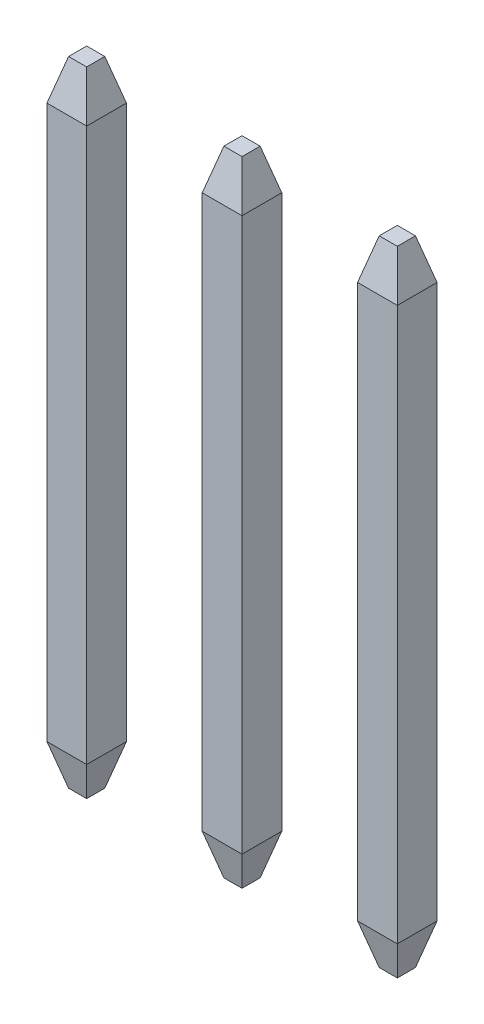
ISO-10303-21;
HEADER;
FILE_DESCRIPTION(('STEP AP214'),'2;1');
FILE_NAME('part.step','',(''),(''),'','','');
FILE_SCHEMA(('AUTOMOTIVE_DESIGN { 1 0 10303 214 1 1 1 1 }'));
ENDSEC;
DATA;
#1=APPLICATION_CONTEXT('core data for automotive mechanical design processes');
#2=APPLICATION_PROTOCOL_DEFINITION('international standard','automotive_design',2000,#1);
#3=PRODUCT_CONTEXT('',#1,'mechanical');
#4=PRODUCT('Part','Part','',(#3));
#5=PRODUCT_RELATED_PRODUCT_CATEGORY('part','',(#4));
#6=PRODUCT_DEFINITION_FORMATION('','',#4);
#7=PRODUCT_DEFINITION_CONTEXT('part definition',#1,'design');
#8=PRODUCT_DEFINITION('design','',#6,#7);
#9=PRODUCT_DEFINITION_SHAPE('','',#8);
#10=(LENGTH_UNIT() NAMED_UNIT(*) SI_UNIT(.MILLI.,.METRE.));
#11=(NAMED_UNIT(*) PLANE_ANGLE_UNIT() SI_UNIT($,.RADIAN.));
#12=(NAMED_UNIT(*) SI_UNIT($,.STERADIAN.) SOLID_ANGLE_UNIT());
#13=UNCERTAINTY_MEASURE_WITH_UNIT(LENGTH_MEASURE(1.E-05),#10,'distance_accuracy_value','');
#14=(GEOMETRIC_REPRESENTATION_CONTEXT(3) GLOBAL_UNCERTAINTY_ASSIGNED_CONTEXT((#13)) GLOBAL_UNIT_ASSIGNED_CONTEXT((#10,
#11,#12)) REPRESENTATION_CONTEXT('',''));
#15=CARTESIAN_POINT('',(0.,0.,0.));
#16=DIRECTION('',(0.,0.,1.));
#17=DIRECTION('',(1.,0.,0.));
#18=AXIS2_PLACEMENT_3D('',#15,#16,#17);
#19=CARTESIAN_POINT('',(-0.32,6.15,0.82));
#20=DIRECTION('',(0.,-0.258819045102985,-0.965925826288944));
#21=DIRECTION('',(0.,-0.965925826288944,0.258819045102985));
#22=AXIS2_PLACEMENT_3D('',#19,#20,#21);
#23=PLANE('',#22);
#24=DIRECTION('',(-0.250562807085973,0.9351131265309,-0.250562807085973));
#25=VECTOR('',#24,1.);
#26=CARTESIAN_POINT('',(0.13667737674,6.834169344185,0.63667737674));
#27=LINE('',#26,#25);
#28=CARTESIAN_POINT('',(0.32,6.15,0.82));
#29=VERTEX_POINT('',#28);
#30=CARTESIAN_POINT('',(0.14583302492,6.8,0.64583302492));
#31=VERTEX_POINT('',#30);
#32=EDGE_CURVE('P0_E26',#29,#31,#27,.T.);
#33=ORIENTED_EDGE('',*,*,#32,.T.);
#34=DIRECTION('',(1.,0.,0.));
#35=VECTOR('',#34,1.);
#36=CARTESIAN_POINT('',(0.,6.8,0.64583302492));
#37=LINE('',#36,#35);
#38=CARTESIAN_POINT('',(-0.14583302492,6.8,0.64583302492));
#39=VERTEX_POINT('',#38);
#40=EDGE_CURVE('P0_E185',#39,#31,#37,.T.);
#41=ORIENTED_EDGE('',*,*,#40,.F.);
#42=DIRECTION('',(-0.250562807085973,-0.9351131265309,0.250562807085973));
#43=VECTOR('',#42,1.);
#44=CARTESIAN_POINT('',(-0.13667737674,6.834169344185,0.63667737674));
#45=LINE('',#44,#43);
#46=CARTESIAN_POINT('',(-0.32,6.15,0.82));
#47=VERTEX_POINT('',#46);
#48=EDGE_CURVE('P0_E11',#39,#47,#45,.T.);
#49=ORIENTED_EDGE('',*,*,#48,.T.);
#50=DIRECTION('',(-1.,0.,0.));
#51=VECTOR('',#50,1.);
#52=CARTESIAN_POINT('',(-0.32,6.15,0.82));
#53=LINE('',#52,#51);
#54=EDGE_CURVE('P0_E129',#29,#47,#53,.T.);
#55=ORIENTED_EDGE('',*,*,#54,.F.);
#56=EDGE_LOOP('',(#33,#41,#49,#55));
#57=FACE_BOUND('',#56,.T.);
#58=ADVANCED_FACE('P0_F17',(#57),#23,.F.);
#59=CARTESIAN_POINT('',(-0.14583302492,6.8,0.5));
#60=DIRECTION('',(0.965925826288944,-0.258819045102985,0.));
#61=DIRECTION('',(0.,0.,-1.));
#62=AXIS2_PLACEMENT_3D('',#59,#60,#61);
#63=PLANE('',#62);
#64=DIRECTION('',(-0.250562807085973,-0.9351131265309,-0.250562807085973));
#65=VECTOR('',#64,1.);
#66=CARTESIAN_POINT('',(-0.13667737674,6.834169344185,0.36332262326));
#67=LINE('',#66,#65);
#68=CARTESIAN_POINT('',(-0.14583302492,6.8,0.35416697508));
#69=VERTEX_POINT('',#68);
#70=CARTESIAN_POINT('',(-0.32,6.15,0.18));
#71=VERTEX_POINT('',#70);
#72=EDGE_CURVE('P0_E197',#69,#71,#67,.T.);
#73=ORIENTED_EDGE('',*,*,#72,.T.);
#74=DIRECTION('',(0.,0.,-1.));
#75=VECTOR('',#74,1.);
#76=CARTESIAN_POINT('',(-0.32,6.15,0.82));
#77=LINE('',#76,#75);
#78=EDGE_CURVE('P0_E171',#47,#71,#77,.T.);
#79=ORIENTED_EDGE('',*,*,#78,.F.);
#80=ORIENTED_EDGE('',*,*,#48,.F.);
#81=DIRECTION('',(0.,0.,1.));
#82=VECTOR('',#81,1.);
#83=CARTESIAN_POINT('',(-0.14583302492,6.8,0.5));
#84=LINE('',#83,#82);
#85=EDGE_CURVE('P0_E181',#69,#39,#84,.T.);
#86=ORIENTED_EDGE('',*,*,#85,.F.);
#87=EDGE_LOOP('',(#73,#79,#80,#86));
#88=FACE_BOUND('',#87,.T.);
#89=ADVANCED_FACE('P0_F19',(#88),#63,.F.);
#90=CARTESIAN_POINT('',(0.14583302492,6.8,0.5));
#91=DIRECTION('',(-0.965925826288944,-0.258819045102985,0.));
#92=DIRECTION('',(-0.258819045102985,0.965925826288944,0.));
#93=AXIS2_PLACEMENT_3D('',#90,#91,#92);
#94=PLANE('',#93);
#95=DIRECTION('',(-0.250562807085973,0.9351131265309,0.250562807085973));
#96=VECTOR('',#95,1.);
#97=CARTESIAN_POINT('',(0.13667737674,6.834169344185,0.36332262326));
#98=LINE('',#97,#96);
#99=CARTESIAN_POINT('',(0.32,6.15,0.18));
#100=VERTEX_POINT('',#99);
#101=CARTESIAN_POINT('',(0.14583302492,6.8,0.35416697508));
#102=VERTEX_POINT('',#101);
#103=EDGE_CURVE('P0_E38',#100,#102,#98,.T.);
#104=ORIENTED_EDGE('',*,*,#103,.T.);
#105=DIRECTION('',(0.,0.,-1.));
#106=VECTOR('',#105,1.);
#107=CARTESIAN_POINT('',(0.14583302492,6.8,0.5));
#108=LINE('',#107,#106);
#109=EDGE_CURVE('P0_E189',#31,#102,#108,.T.);
#110=ORIENTED_EDGE('',*,*,#109,.F.);
#111=ORIENTED_EDGE('',*,*,#32,.F.);
#112=DIRECTION('',(0.,0.,1.));
#113=VECTOR('',#112,1.);
#114=CARTESIAN_POINT('',(0.32,6.15,0.82));
#115=LINE('',#114,#113);
#116=EDGE_CURVE('P0_E130',#100,#29,#115,.T.);
#117=ORIENTED_EDGE('',*,*,#116,.F.);
#118=EDGE_LOOP('',(#104,#110,#111,#117));
#119=FACE_BOUND('',#118,.T.);
#120=ADVANCED_FACE('P0_F327',(#119),#94,.F.);
#121=CARTESIAN_POINT('',(0.,6.8,0.35416697508));
#122=DIRECTION('',(0.,-0.258819045102985,0.965925826288944));
#123=DIRECTION('',(-1.,0.,0.));
#124=AXIS2_PLACEMENT_3D('',#121,#122,#123);
#125=PLANE('',#124);
#126=ORIENTED_EDGE('',*,*,#72,.F.);
#127=DIRECTION('',(-1.,0.,0.));
#128=VECTOR('',#127,1.);
#129=CARTESIAN_POINT('',(0.,6.8,0.35416697508));
#130=LINE('',#129,#128);
#131=EDGE_CURVE('P0_E117',#102,#69,#130,.T.);
#132=ORIENTED_EDGE('',*,*,#131,.F.);
#133=ORIENTED_EDGE('',*,*,#103,.F.);
#134=DIRECTION('',(1.,0.,0.));
#135=VECTOR('',#134,1.);
#136=CARTESIAN_POINT('',(-0.32,6.15,0.18));
#137=LINE('',#136,#135);
#138=EDGE_CURVE('P0_E144',#71,#100,#137,.T.);
#139=ORIENTED_EDGE('',*,*,#138,.F.);
#140=EDGE_LOOP('',(#126,#132,#133,#139));
#141=FACE_BOUND('',#140,.T.);
#142=ADVANCED_FACE('P0_F320',(#141),#125,.F.);
#143=CARTESIAN_POINT('',(-0.32,-3.4,0.35416697508));
#144=DIRECTION('',(0.,-0.258819045102985,-0.965925826288944));
#145=DIRECTION('',(0.,-0.965925826288944,0.258819045102985));
#146=AXIS2_PLACEMENT_3D('',#143,#144,#145);
#147=PLANE('',#146);
#148=DIRECTION('',(-0.250562807085973,0.9351131265309,-0.250562807085973));
#149=VECTOR('',#148,1.);
#150=CARTESIAN_POINT('',(-0.116587226245,-3.509146806561,0.383412773755));
#151=LINE('',#150,#149);
#152=CARTESIAN_POINT('',(-0.14583302492,-3.4,0.35416697508));
#153=VERTEX_POINT('',#152);
#154=CARTESIAN_POINT('',(-0.32,-2.75,0.18));
#155=VERTEX_POINT('',#154);
#156=EDGE_CURVE('P0_E157',#153,#155,#151,.T.);
#157=ORIENTED_EDGE('',*,*,#156,.T.);
#158=DIRECTION('',(-1.,0.,0.));
#159=VECTOR('',#158,1.);
#160=CARTESIAN_POINT('',(-0.32,-2.75,0.18));
#161=LINE('',#160,#159);
#162=CARTESIAN_POINT('',(0.32,-2.75,0.18));
#163=VERTEX_POINT('',#162);
#164=EDGE_CURVE('P0_E151',#163,#155,#161,.T.);
#165=ORIENTED_EDGE('',*,*,#164,.F.);
#166=DIRECTION('',(-0.250562807085973,-0.9351131265309,0.250562807085973));
#167=VECTOR('',#166,1.);
#168=CARTESIAN_POINT('',(0.116587226245,-3.509146806561,0.383412773755));
#169=LINE('',#168,#167);
#170=CARTESIAN_POINT('',(0.14583302492,-3.4,0.35416697508));
#171=VERTEX_POINT('',#170);
#172=EDGE_CURVE('P0_E135',#163,#171,#169,.T.);
#173=ORIENTED_EDGE('',*,*,#172,.T.);
#174=DIRECTION('',(1.,0.,0.));
#175=VECTOR('',#174,1.);
#176=CARTESIAN_POINT('',(0.32,-3.4,0.35416697508));
#177=LINE('',#176,#175);
#178=EDGE_CURVE('P0_E283',#153,#171,#177,.T.);
#179=ORIENTED_EDGE('',*,*,#178,.F.);
#180=EDGE_LOOP('',(#157,#165,#173,#179));
#181=FACE_BOUND('',#180,.T.);
#182=ADVANCED_FACE('P0_F318',(#181),#147,.T.);
#183=CARTESIAN_POINT('',(0.14583302492,-3.4,0.82));
#184=DIRECTION('',(0.965925826288944,-0.258819045102985,0.));
#185=DIRECTION('',(0.,0.,-1.));
#186=AXIS2_PLACEMENT_3D('',#183,#184,#185);
#187=PLANE('',#186);
#188=DIRECTION('',(-0.250562807085973,-0.9351131265309,-0.250562807085973));
#189=VECTOR('',#188,1.);
#190=CARTESIAN_POINT('',(0.156767527234,-3.359191881808,0.656767527234));
#191=LINE('',#190,#189);
#192=CARTESIAN_POINT('',(0.32,-2.75,0.82));
#193=VERTEX_POINT('',#192);
#194=CARTESIAN_POINT('',(0.14583302492,-3.4,0.64583302492));
#195=VERTEX_POINT('',#194);
#196=EDGE_CURVE('P0_E104',#193,#195,#191,.T.);
#197=ORIENTED_EDGE('',*,*,#196,.T.);
#198=DIRECTION('',(0.,0.,1.));
#199=VECTOR('',#198,1.);
#200=CARTESIAN_POINT('',(0.14583302492,-3.4,0.82));
#201=LINE('',#200,#199);
#202=EDGE_CURVE('P0_E161',#171,#195,#201,.T.);
#203=ORIENTED_EDGE('',*,*,#202,.F.);
#204=ORIENTED_EDGE('',*,*,#172,.F.);
#205=DIRECTION('',(0.,0.,-1.));
#206=VECTOR('',#205,1.);
#207=CARTESIAN_POINT('',(0.32,-2.75,0.18));
#208=LINE('',#207,#206);
#209=EDGE_CURVE('P0_E133',#193,#163,#208,.T.);
#210=ORIENTED_EDGE('',*,*,#209,.F.);
#211=EDGE_LOOP('',(#197,#203,#204,#210));
#212=FACE_BOUND('',#211,.T.);
#213=ADVANCED_FACE('P0_F134',(#212),#187,.T.);
#214=CARTESIAN_POINT('',(-0.14583302492,-3.4,0.82));
#215=DIRECTION('',(-0.965925826288944,-0.258819045102985,0.));
#216=DIRECTION('',(-0.258819045102985,0.965925826288944,0.));
#217=AXIS2_PLACEMENT_3D('',#214,#215,#216);
#218=PLANE('',#217);
#219=DIRECTION('',(-0.250562807085973,0.9351131265309,0.250562807085973));
#220=VECTOR('',#219,1.);
#221=CARTESIAN_POINT('',(-0.156767527234,-3.359191881808,0.656767527234));
#222=LINE('',#221,#220);
#223=CARTESIAN_POINT('',(-0.14583302492,-3.4,0.64583302492));
#224=VERTEX_POINT('',#223);
#225=CARTESIAN_POINT('',(-0.32,-2.75,0.82));
#226=VERTEX_POINT('',#225);
#227=EDGE_CURVE('P0_E116',#224,#226,#222,.T.);
#228=ORIENTED_EDGE('',*,*,#227,.T.);
#229=DIRECTION('',(0.,0.,1.));
#230=VECTOR('',#229,1.);
#231=CARTESIAN_POINT('',(-0.32,-2.75,0.82));
#232=LINE('',#231,#230);
#233=EDGE_CURVE('P0_E165',#155,#226,#232,.T.);
#234=ORIENTED_EDGE('',*,*,#233,.F.);
#235=ORIENTED_EDGE('',*,*,#156,.F.);
#236=DIRECTION('',(0.,0.,-1.));
#237=VECTOR('',#236,1.);
#238=CARTESIAN_POINT('',(-0.14583302492,-3.4,0.18));
#239=LINE('',#238,#237);
#240=EDGE_CURVE('P0_E288',#224,#153,#239,.T.);
#241=ORIENTED_EDGE('',*,*,#240,.F.);
#242=EDGE_LOOP('',(#228,#234,#235,#241));
#243=FACE_BOUND('',#242,.T.);
#244=ADVANCED_FACE('P0_F313',(#243),#218,.T.);
#245=CARTESIAN_POINT('',(-0.32,-3.4,0.64583302492));
#246=DIRECTION('',(0.,-0.258819045102985,0.965925826288944));
#247=DIRECTION('',(-1.,0.,0.));
#248=AXIS2_PLACEMENT_3D('',#245,#246,#247);
#249=PLANE('',#248);
#250=ORIENTED_EDGE('',*,*,#196,.F.);
#251=DIRECTION('',(1.,0.,0.));
#252=VECTOR('',#251,1.);
#253=CARTESIAN_POINT('',(0.32,-2.75,0.82));
#254=LINE('',#253,#252);
#255=EDGE_CURVE('P0_E107',#226,#193,#254,.T.);
#256=ORIENTED_EDGE('',*,*,#255,.F.);
#257=ORIENTED_EDGE('',*,*,#227,.F.);
#258=DIRECTION('',(-1.,0.,0.));
#259=VECTOR('',#258,1.);
#260=CARTESIAN_POINT('',(-0.32,-3.4,0.64583302492));
#261=LINE('',#260,#259);
#262=EDGE_CURVE('P0_E110',#195,#224,#261,.T.);
#263=ORIENTED_EDGE('',*,*,#262,.F.);
#264=EDGE_LOOP('',(#250,#256,#257,#263));
#265=FACE_BOUND('',#264,.T.);
#266=ADVANCED_FACE('P0_F106',(#265),#249,.T.);
#267=CARTESIAN_POINT('',(0.,6.8,0.5));
#268=DIRECTION('',(0.,-1.,0.));
#269=DIRECTION('',(0.,0.,-1.));
#270=AXIS2_PLACEMENT_3D('',#267,#268,#269);
#271=PLANE('',#270);
#272=ORIENTED_EDGE('',*,*,#85,.T.);
#273=ORIENTED_EDGE('',*,*,#40,.T.);
#274=ORIENTED_EDGE('',*,*,#109,.T.);
#275=ORIENTED_EDGE('',*,*,#131,.T.);
#276=EDGE_LOOP('',(#272,#273,#274,#275));
#277=FACE_BOUND('',#276,.T.);
#278=ADVANCED_FACE('P0_F343',(#277),#271,.F.);
#279=CARTESIAN_POINT('',(-0.32,7.705096679919,0.82));
#280=DIRECTION('',(0.,0.,-1.));
#281=DIRECTION('',(-1.,0.,0.));
#282=AXIS2_PLACEMENT_3D('',#279,#280,#281);
#283=PLANE('',#282);
#284=DIRECTION('',(0.,-1.,0.));
#285=VECTOR('',#284,1.);
#286=CARTESIAN_POINT('',(-0.32,7.705096679919,0.82));
#287=LINE('',#286,#285);
#288=EDGE_CURVE('P0_E126',#47,#226,#287,.T.);
#289=ORIENTED_EDGE('',*,*,#288,.T.);
#290=ORIENTED_EDGE('',*,*,#255,.T.);
#291=DIRECTION('',(0.,1.,0.));
#292=VECTOR('',#291,1.);
#293=CARTESIAN_POINT('',(0.32,7.705096679919,0.82));
#294=LINE('',#293,#292);
#295=EDGE_CURVE('P0_E124',#193,#29,#294,.T.);
#296=ORIENTED_EDGE('',*,*,#295,.T.);
#297=ORIENTED_EDGE('',*,*,#54,.T.);
#298=EDGE_LOOP('',(#289,#290,#296,#297));
#299=FACE_BOUND('',#298,.T.);
#300=ADVANCED_FACE('P0_F121',(#299),#283,.F.);
#301=CARTESIAN_POINT('',(0.32,7.705096679919,0.82));
#302=DIRECTION('',(-1.,0.,0.));
#303=DIRECTION('',(0.,0.,1.));
#304=AXIS2_PLACEMENT_3D('',#301,#302,#303);
#305=PLANE('',#304);
#306=ORIENTED_EDGE('',*,*,#295,.F.);
#307=ORIENTED_EDGE('',*,*,#209,.T.);
#308=DIRECTION('',(0.,1.,0.));
#309=VECTOR('',#308,1.);
#310=CARTESIAN_POINT('',(0.32,7.705096679919,0.18));
#311=LINE('',#310,#309);
#312=EDGE_CURVE('P0_E168',#163,#100,#311,.T.);
#313=ORIENTED_EDGE('',*,*,#312,.T.);
#314=ORIENTED_EDGE('',*,*,#116,.T.);
#315=EDGE_LOOP('',(#306,#307,#313,#314));
#316=FACE_BOUND('',#315,.T.);
#317=ADVANCED_FACE('P0_F142',(#316),#305,.F.);
#318=CARTESIAN_POINT('',(-0.32,7.705096679919,0.18));
#319=DIRECTION('',(0.,0.,1.));
#320=DIRECTION('',(1.,0.,0.));
#321=AXIS2_PLACEMENT_3D('',#318,#319,#320);
#322=PLANE('',#321);
#323=ORIENTED_EDGE('',*,*,#312,.F.);
#324=ORIENTED_EDGE('',*,*,#164,.T.);
#325=DIRECTION('',(0.,-1.,0.));
#326=VECTOR('',#325,1.);
#327=CARTESIAN_POINT('',(-0.32,7.705096679919,0.18));
#328=LINE('',#327,#326);
#329=EDGE_CURVE('P0_E160',#71,#155,#328,.T.);
#330=ORIENTED_EDGE('',*,*,#329,.F.);
#331=ORIENTED_EDGE('',*,*,#138,.T.);
#332=EDGE_LOOP('',(#323,#324,#330,#331));
#333=FACE_BOUND('',#332,.T.);
#334=ADVANCED_FACE('P0_F308',(#333),#322,.F.);
#335=CARTESIAN_POINT('',(-0.32,7.705096679919,0.82));
#336=DIRECTION('',(1.,0.,0.));
#337=DIRECTION('',(0.,1.,0.));
#338=AXIS2_PLACEMENT_3D('',#335,#336,#337);
#339=PLANE('',#338);
#340=ORIENTED_EDGE('',*,*,#329,.T.);
#341=ORIENTED_EDGE('',*,*,#233,.T.);
#342=ORIENTED_EDGE('',*,*,#288,.F.);
#343=ORIENTED_EDGE('',*,*,#78,.T.);
#344=EDGE_LOOP('',(#340,#341,#342,#343));
#345=FACE_BOUND('',#344,.T.);
#346=ADVANCED_FACE('P0_F304',(#345),#339,.F.);
#347=CARTESIAN_POINT('',(-0.32,-3.4,0.82));
#348=DIRECTION('',(0.,-1.,0.));
#349=DIRECTION('',(0.,0.,-1.));
#350=AXIS2_PLACEMENT_3D('',#347,#348,#349);
#351=PLANE('',#350);
#352=ORIENTED_EDGE('',*,*,#240,.T.);
#353=ORIENTED_EDGE('',*,*,#178,.T.);
#354=ORIENTED_EDGE('',*,*,#202,.T.);
#355=ORIENTED_EDGE('',*,*,#262,.T.);
#356=EDGE_LOOP('',(#352,#353,#354,#355));
#357=FACE_BOUND('',#356,.T.);
#358=ADVANCED_FACE('P0_F317',(#357),#351,.T.);
#359=CLOSED_SHELL('',(#58,#89,#120,#142,#182,#213,#244,#266,#278,#300,#317,#334,#346,#358));
#360=MANIFOLD_SOLID_BREP('P0_B1',#359);
#361=CARTESIAN_POINT('',(-2.82,-3.4,0.35416697508));
#362=DIRECTION('',(0.,-0.258819045102985,-0.965925826288944));
#363=DIRECTION('',(0.,-0.965925826288944,0.258819045102985));
#364=AXIS2_PLACEMENT_3D('',#361,#362,#363);
#365=PLANE('',#364);
#366=DIRECTION('',(-0.250562807085973,0.9351131265309,-0.250562807085973));
#367=VECTOR('',#366,1.);
#368=CARTESIAN_POINT('',(-2.616587226245,-3.509146806561,0.383412773755));
#369=LINE('',#368,#367);
#370=CARTESIAN_POINT('',(-2.64583302492,-3.4,0.35416697508));
#371=VERTEX_POINT('',#370);
#372=CARTESIAN_POINT('',(-2.82,-2.75,0.18));
#373=VERTEX_POINT('',#372);
#374=EDGE_CURVE('P1_E26',#371,#373,#369,.T.);
#375=ORIENTED_EDGE('',*,*,#374,.T.);
#376=DIRECTION('',(-1.,0.,0.));
#377=VECTOR('',#376,1.);
#378=CARTESIAN_POINT('',(-2.82,-2.75,0.18));
#379=LINE('',#378,#377);
#380=CARTESIAN_POINT('',(-2.18,-2.75,0.18));
#381=VERTEX_POINT('',#380);
#382=EDGE_CURVE('P1_E177',#381,#373,#379,.T.);
#383=ORIENTED_EDGE('',*,*,#382,.F.);
#384=DIRECTION('',(-0.250562807085973,-0.9351131265309,0.250562807085973));
#385=VECTOR('',#384,1.);
#386=CARTESIAN_POINT('',(-2.383412773755,-3.509146806561,0.383412773755));
#387=LINE('',#386,#385);
#388=CARTESIAN_POINT('',(-2.35416697508,-3.4,0.35416697508));
#389=VERTEX_POINT('',#388);
#390=EDGE_CURVE('P1_E11',#381,#389,#387,.T.);
#391=ORIENTED_EDGE('',*,*,#390,.T.);
#392=DIRECTION('',(1.,0.,0.));
#393=VECTOR('',#392,1.);
#394=CARTESIAN_POINT('',(-2.18,-3.4,0.35416697508));
#395=LINE('',#394,#393);
#396=EDGE_CURVE('P1_E130',#371,#389,#395,.T.);
#397=ORIENTED_EDGE('',*,*,#396,.F.);
#398=EDGE_LOOP('',(#375,#383,#391,#397));
#399=FACE_BOUND('',#398,.T.);
#400=ADVANCED_FACE('P1_F17',(#399),#365,.T.);
#401=CARTESIAN_POINT('',(-2.35416697508,-3.4,0.82));
#402=DIRECTION('',(0.965925826288944,-0.258819045102985,0.));
#403=DIRECTION('',(0.,0.,-1.));
#404=AXIS2_PLACEMENT_3D('',#401,#402,#403);
#405=PLANE('',#404);
#406=DIRECTION('',(-0.250562807085973,-0.9351131265309,-0.250562807085973));
#407=VECTOR('',#406,1.);
#408=CARTESIAN_POINT('',(-2.343232472766,-3.359191881808,0.656767527234));
#409=LINE('',#408,#407);
#410=CARTESIAN_POINT('',(-2.18,-2.75,0.82));
#411=VERTEX_POINT('',#410);
#412=CARTESIAN_POINT('',(-2.35416697508,-3.4,0.64583302492));
#413=VERTEX_POINT('',#412);
#414=EDGE_CURVE('P1_E105',#411,#413,#409,.T.);
#415=ORIENTED_EDGE('',*,*,#414,.T.);
#416=DIRECTION('',(0.,0.,1.));
#417=VECTOR('',#416,1.);
#418=CARTESIAN_POINT('',(-2.35416697508,-3.4,0.82));
#419=LINE('',#418,#417);
#420=EDGE_CURVE('P1_E108',#389,#413,#419,.T.);
#421=ORIENTED_EDGE('',*,*,#420,.F.);
#422=ORIENTED_EDGE('',*,*,#390,.F.);
#423=DIRECTION('',(0.,0.,-1.));
#424=VECTOR('',#423,1.);
#425=CARTESIAN_POINT('',(-2.18,-2.75,0.18));
#426=LINE('',#425,#424);
#427=EDGE_CURVE('P1_E111',#411,#381,#426,.T.);
#428=ORIENTED_EDGE('',*,*,#427,.F.);
#429=EDGE_LOOP('',(#415,#421,#422,#428));
#430=FACE_BOUND('',#429,.T.);
#431=ADVANCED_FACE('P1_F19',(#430),#405,.T.);
#432=CARTESIAN_POINT('',(-2.64583302492,-3.4,0.82));
#433=DIRECTION('',(-0.965925826288944,-0.258819045102985,0.));
#434=DIRECTION('',(-0.258819045102985,0.965925826288944,0.));
#435=AXIS2_PLACEMENT_3D('',#432,#433,#434);
#436=PLANE('',#435);
#437=DIRECTION('',(-0.250562807085973,0.9351131265309,0.250562807085973));
#438=VECTOR('',#437,1.);
#439=CARTESIAN_POINT('',(-2.656767527234,-3.359191881808,0.656767527234));
#440=LINE('',#439,#438);
#441=CARTESIAN_POINT('',(-2.64583302492,-3.4,0.64583302492));
#442=VERTEX_POINT('',#441);
#443=CARTESIAN_POINT('',(-2.82,-2.75,0.82));
#444=VERTEX_POINT('',#443);
#445=EDGE_CURVE('P1_E116',#442,#444,#440,.T.);
#446=ORIENTED_EDGE('',*,*,#445,.T.);
#447=DIRECTION('',(0.,0.,1.));
#448=VECTOR('',#447,1.);
#449=CARTESIAN_POINT('',(-2.82,-2.75,0.82));
#450=LINE('',#449,#448);
#451=EDGE_CURVE('P1_E141',#373,#444,#450,.T.);
#452=ORIENTED_EDGE('',*,*,#451,.F.);
#453=ORIENTED_EDGE('',*,*,#374,.F.);
#454=DIRECTION('',(0.,0.,-1.));
#455=VECTOR('',#454,1.);
#456=CARTESIAN_POINT('',(-2.64583302492,-3.4,0.18));
#457=LINE('',#456,#455);
#458=EDGE_CURVE('P1_E137',#442,#371,#457,.T.);
#459=ORIENTED_EDGE('',*,*,#458,.F.);
#460=EDGE_LOOP('',(#446,#452,#453,#459));
#461=FACE_BOUND('',#460,.T.);
#462=ADVANCED_FACE('P1_F222',(#461),#436,.T.);
#463=CARTESIAN_POINT('',(-2.82,-3.4,0.64583302492));
#464=DIRECTION('',(0.,-0.258819045102985,0.965925826288944));
#465=DIRECTION('',(-1.,0.,0.));
#466=AXIS2_PLACEMENT_3D('',#463,#464,#465);
#467=PLANE('',#466);
#468=ORIENTED_EDGE('',*,*,#414,.F.);
#469=DIRECTION('',(1.,0.,0.));
#470=VECTOR('',#469,1.);
#471=CARTESIAN_POINT('',(-2.18,-2.75,0.82));
#472=LINE('',#471,#470);
#473=EDGE_CURVE('P1_E159',#444,#411,#472,.T.);
#474=ORIENTED_EDGE('',*,*,#473,.F.);
#475=ORIENTED_EDGE('',*,*,#445,.F.);
#476=DIRECTION('',(-1.,0.,0.));
#477=VECTOR('',#476,1.);
#478=CARTESIAN_POINT('',(-2.82,-3.4,0.64583302492));
#479=LINE('',#478,#477);
#480=EDGE_CURVE('P1_E120',#413,#442,#479,.T.);
#481=ORIENTED_EDGE('',*,*,#480,.F.);
#482=EDGE_LOOP('',(#468,#474,#475,#481));
#483=FACE_BOUND('',#482,.T.);
#484=ADVANCED_FACE('P1_F121',(#483),#467,.T.);
#485=CARTESIAN_POINT('',(-2.82,6.15,0.82));
#486=DIRECTION('',(0.,-0.258819045102985,-0.965925826288944));
#487=DIRECTION('',(0.,-0.965925826288944,0.258819045102985));
#488=AXIS2_PLACEMENT_3D('',#485,#486,#487);
#489=PLANE('',#488);
#490=DIRECTION('',(-0.250562807085973,0.9351131265309,-0.250562807085973));
#491=VECTOR('',#490,1.);
#492=CARTESIAN_POINT('',(-2.36332262326,6.834169344185,0.63667737674));
#493=LINE('',#492,#491);
#494=CARTESIAN_POINT('',(-2.18,6.15,0.82));
#495=VERTEX_POINT('',#494);
#496=CARTESIAN_POINT('',(-2.35416697508,6.8,0.64583302492));
#497=VERTEX_POINT('',#496);
#498=EDGE_CURVE('P1_E48',#495,#497,#493,.T.);
#499=ORIENTED_EDGE('',*,*,#498,.T.);
#500=DIRECTION('',(1.,0.,0.));
#501=VECTOR('',#500,1.);
#502=CARTESIAN_POINT('',(0.,6.8,0.64583302492));
#503=LINE('',#502,#501);
#504=CARTESIAN_POINT('',(-2.64583302492,6.8,0.64583302492));
#505=VERTEX_POINT('',#504);
#506=EDGE_CURVE('P1_E197',#505,#497,#503,.T.);
#507=ORIENTED_EDGE('',*,*,#506,.F.);
#508=DIRECTION('',(-0.250562807085973,-0.9351131265309,0.250562807085973));
#509=VECTOR('',#508,1.);
#510=CARTESIAN_POINT('',(-2.63667737674,6.834169344185,0.63667737674));
#511=LINE('',#510,#509);
#512=CARTESIAN_POINT('',(-2.82,6.15,0.82));
#513=VERTEX_POINT('',#512);
#514=EDGE_CURVE('P1_E117',#505,#513,#511,.T.);
#515=ORIENTED_EDGE('',*,*,#514,.T.);
#516=DIRECTION('',(-1.,0.,0.));
#517=VECTOR('',#516,1.);
#518=CARTESIAN_POINT('',(-2.82,6.15,0.82));
#519=LINE('',#518,#517);
#520=EDGE_CURVE('P1_E150',#495,#513,#519,.T.);
#521=ORIENTED_EDGE('',*,*,#520,.F.);
#522=EDGE_LOOP('',(#499,#507,#515,#521));
#523=FACE_BOUND('',#522,.T.);
#524=ADVANCED_FACE('P1_F239',(#523),#489,.F.);
#525=CARTESIAN_POINT('',(-2.64583302492,6.8,0.5));
#526=DIRECTION('',(0.965925826288944,-0.258819045102985,0.));
#527=DIRECTION('',(0.,0.,-1.));
#528=AXIS2_PLACEMENT_3D('',#525,#526,#527);
#529=PLANE('',#528);
#530=DIRECTION('',(-0.250562807085973,-0.9351131265309,-0.250562807085973));
#531=VECTOR('',#530,1.);
#532=CARTESIAN_POINT('',(-2.479723076003,7.419930769001,0.520276923997));
#533=LINE('',#532,#531);
#534=CARTESIAN_POINT('',(-2.64583302492,6.8,0.35416697508));
#535=VERTEX_POINT('',#534);
#536=CARTESIAN_POINT('',(-2.82,6.15,0.18));
#537=VERTEX_POINT('',#536);
#538=EDGE_CURVE('P1_E189',#535,#537,#533,.T.);
#539=ORIENTED_EDGE('',*,*,#538,.T.);
#540=DIRECTION('',(0.,0.,-1.));
#541=VECTOR('',#540,1.);
#542=CARTESIAN_POINT('',(-2.82,6.15,0.82));
#543=LINE('',#542,#541);
#544=EDGE_CURVE('P1_E155',#513,#537,#543,.T.);
#545=ORIENTED_EDGE('',*,*,#544,.F.);
#546=ORIENTED_EDGE('',*,*,#514,.F.);
#547=DIRECTION('',(0.,0.,1.));
#548=VECTOR('',#547,1.);
#549=CARTESIAN_POINT('',(-2.64583302492,6.8,0.5));
#550=LINE('',#549,#548);
#551=EDGE_CURVE('P1_E193',#535,#505,#550,.T.);
#552=ORIENTED_EDGE('',*,*,#551,.F.);
#553=EDGE_LOOP('',(#539,#545,#546,#552));
#554=FACE_BOUND('',#553,.T.);
#555=ADVANCED_FACE('P1_F228',(#554),#529,.F.);
#556=CARTESIAN_POINT('',(-2.35416697508,6.8,0.5));
#557=DIRECTION('',(-0.965925826288944,-0.258819045102985,0.));
#558=DIRECTION('',(-0.258819045102985,0.965925826288944,0.));
#559=AXIS2_PLACEMENT_3D('',#556,#557,#558);
#560=PLANE('',#559);
#561=DIRECTION('',(-0.250562807085973,0.9351131265309,0.250562807085973));
#562=VECTOR('',#561,1.);
#563=CARTESIAN_POINT('',(-2.36332262326,6.834169344185,0.36332262326));
#564=LINE('',#563,#562);
#565=CARTESIAN_POINT('',(-2.18,6.15,0.18));
#566=VERTEX_POINT('',#565);
#567=CARTESIAN_POINT('',(-2.35416697508,6.8,0.35416697508));
#568=VERTEX_POINT('',#567);
#569=EDGE_CURVE('P1_E38',#566,#568,#564,.T.);
#570=ORIENTED_EDGE('',*,*,#569,.T.);
#571=DIRECTION('',(0.,0.,-1.));
#572=VECTOR('',#571,1.);
#573=CARTESIAN_POINT('',(-2.35416697508,6.8,0.5));
#574=LINE('',#573,#572);
#575=EDGE_CURVE('P1_E190',#497,#568,#574,.T.);
#576=ORIENTED_EDGE('',*,*,#575,.F.);
#577=ORIENTED_EDGE('',*,*,#498,.F.);
#578=DIRECTION('',(0.,0.,1.));
#579=VECTOR('',#578,1.);
#580=CARTESIAN_POINT('',(-2.18,6.15,0.82));
#581=LINE('',#580,#579);
#582=EDGE_CURVE('P1_E178',#566,#495,#581,.T.);
#583=ORIENTED_EDGE('',*,*,#582,.F.);
#584=EDGE_LOOP('',(#570,#576,#577,#583));
#585=FACE_BOUND('',#584,.T.);
#586=ADVANCED_FACE('P1_F233',(#585),#560,.F.);
#587=CARTESIAN_POINT('',(0.,6.8,0.35416697508));
#588=DIRECTION('',(0.,-0.258819045102985,0.965925826288944));
#589=DIRECTION('',(-1.,0.,0.));
#590=AXIS2_PLACEMENT_3D('',#587,#588,#589);
#591=PLANE('',#590);
#592=ORIENTED_EDGE('',*,*,#538,.F.);
#593=DIRECTION('',(-1.,0.,0.));
#594=VECTOR('',#593,1.);
#595=CARTESIAN_POINT('',(0.,6.8,0.35416697508));
#596=LINE('',#595,#594);
#597=EDGE_CURVE('P1_E185',#568,#535,#596,.T.);
#598=ORIENTED_EDGE('',*,*,#597,.F.);
#599=ORIENTED_EDGE('',*,*,#569,.F.);
#600=DIRECTION('',(1.,0.,0.));
#601=VECTOR('',#600,1.);
#602=CARTESIAN_POINT('',(-2.82,6.15,0.18));
#603=LINE('',#602,#601);
#604=EDGE_CURVE('P1_E144',#537,#566,#603,.T.);
#605=ORIENTED_EDGE('',*,*,#604,.F.);
#606=EDGE_LOOP('',(#592,#598,#599,#605));
#607=FACE_BOUND('',#606,.T.);
#608=ADVANCED_FACE('P1_F232',(#607),#591,.F.);
#609=CARTESIAN_POINT('',(0.,6.8,0.5));
#610=DIRECTION('',(0.,-1.,0.));
#611=DIRECTION('',(0.,0.,-1.));
#612=AXIS2_PLACEMENT_3D('',#609,#610,#611);
#613=PLANE('',#612);
#614=ORIENTED_EDGE('',*,*,#551,.T.);
#615=ORIENTED_EDGE('',*,*,#506,.T.);
#616=ORIENTED_EDGE('',*,*,#575,.T.);
#617=ORIENTED_EDGE('',*,*,#597,.T.);
#618=EDGE_LOOP('',(#614,#615,#616,#617));
#619=FACE_BOUND('',#618,.T.);
#620=ADVANCED_FACE('P1_F241',(#619),#613,.F.);
#621=CARTESIAN_POINT('',(-2.18,7.705096679919,0.82));
#622=DIRECTION('',(-1.,0.,0.));
#623=DIRECTION('',(0.,0.,1.));
#624=AXIS2_PLACEMENT_3D('',#621,#622,#623);
#625=PLANE('',#624);
#626=DIRECTION('',(0.,1.,0.));
#627=VECTOR('',#626,1.);
#628=CARTESIAN_POINT('',(-2.18,7.705096679919,0.18));
#629=LINE('',#628,#627);
#630=EDGE_CURVE('P1_E173',#381,#566,#629,.T.);
#631=ORIENTED_EDGE('',*,*,#630,.T.);
#632=ORIENTED_EDGE('',*,*,#582,.T.);
#633=DIRECTION('',(0.,1.,0.));
#634=VECTOR('',#633,1.);
#635=CARTESIAN_POINT('',(-2.18,7.705096679919,0.82));
#636=LINE('',#635,#634);
#637=EDGE_CURVE('P1_E126',#411,#495,#636,.T.);
#638=ORIENTED_EDGE('',*,*,#637,.F.);
#639=ORIENTED_EDGE('',*,*,#427,.T.);
#640=EDGE_LOOP('',(#631,#632,#638,#639));
#641=FACE_BOUND('',#640,.T.);
#642=ADVANCED_FACE('P1_F236',(#641),#625,.F.);
#643=CARTESIAN_POINT('',(-2.82,7.705096679919,0.18));
#644=DIRECTION('',(0.,0.,1.));
#645=DIRECTION('',(1.,0.,0.));
#646=AXIS2_PLACEMENT_3D('',#643,#644,#645);
#647=PLANE('',#646);
#648=DIRECTION('',(0.,-1.,0.));
#649=VECTOR('',#648,1.);
#650=CARTESIAN_POINT('',(-2.82,7.705096679919,0.18));
#651=LINE('',#650,#649);
#652=EDGE_CURVE('P1_E145',#537,#373,#651,.T.);
#653=ORIENTED_EDGE('',*,*,#652,.F.);
#654=ORIENTED_EDGE('',*,*,#604,.T.);
#655=ORIENTED_EDGE('',*,*,#630,.F.);
#656=ORIENTED_EDGE('',*,*,#382,.T.);
#657=EDGE_LOOP('',(#653,#654,#655,#656));
#658=FACE_BOUND('',#657,.T.);
#659=ADVANCED_FACE('P1_F221',(#658),#647,.F.);
#660=CARTESIAN_POINT('',(-2.82,7.705096679919,0.82));
#661=DIRECTION('',(1.,0.,0.));
#662=DIRECTION('',(0.,1.,0.));
#663=AXIS2_PLACEMENT_3D('',#660,#661,#662);
#664=PLANE('',#663);
#665=DIRECTION('',(0.,-1.,0.));
#666=VECTOR('',#665,1.);
#667=CARTESIAN_POINT('',(-2.82,7.705096679919,0.82));
#668=LINE('',#667,#666);
#669=EDGE_CURVE('P1_E154',#513,#444,#668,.T.);
#670=ORIENTED_EDGE('',*,*,#669,.F.);
#671=ORIENTED_EDGE('',*,*,#544,.T.);
#672=ORIENTED_EDGE('',*,*,#652,.T.);
#673=ORIENTED_EDGE('',*,*,#451,.T.);
#674=EDGE_LOOP('',(#670,#671,#672,#673));
#675=FACE_BOUND('',#674,.T.);
#676=ADVANCED_FACE('P1_F225',(#675),#664,.F.);
#677=CARTESIAN_POINT('',(-2.82,7.705096679919,0.82));
#678=DIRECTION('',(0.,0.,-1.));
#679=DIRECTION('',(-1.,0.,0.));
#680=AXIS2_PLACEMENT_3D('',#677,#678,#679);
#681=PLANE('',#680);
#682=ORIENTED_EDGE('',*,*,#637,.T.);
#683=ORIENTED_EDGE('',*,*,#520,.T.);
#684=ORIENTED_EDGE('',*,*,#669,.T.);
#685=ORIENTED_EDGE('',*,*,#473,.T.);
#686=EDGE_LOOP('',(#682,#683,#684,#685));
#687=FACE_BOUND('',#686,.T.);
#688=ADVANCED_FACE('P1_F238',(#687),#681,.F.);
#689=CARTESIAN_POINT('',(-2.82,-3.4,0.82));
#690=DIRECTION('',(0.,-1.,0.));
#691=DIRECTION('',(0.,0.,-1.));
#692=AXIS2_PLACEMENT_3D('',#689,#690,#691);
#693=PLANE('',#692);
#694=ORIENTED_EDGE('',*,*,#458,.T.);
#695=ORIENTED_EDGE('',*,*,#396,.T.);
#696=ORIENTED_EDGE('',*,*,#420,.T.);
#697=ORIENTED_EDGE('',*,*,#480,.T.);
#698=EDGE_LOOP('',(#694,#695,#696,#697));
#699=FACE_BOUND('',#698,.T.);
#700=ADVANCED_FACE('P1_F128',(#699),#693,.T.);
#701=CLOSED_SHELL('',(#400,#431,#462,#484,#524,#555,#586,#608,#620,#642,#659,#676,#688,#700));
#702=MANIFOLD_SOLID_BREP('P1_B1',#701);
#703=CARTESIAN_POINT('',(2.18,6.15,0.82));
#704=DIRECTION('',(0.,-0.258819045102985,-0.965925826288944));
#705=DIRECTION('',(0.,-0.965925826288944,0.258819045102985));
#706=AXIS2_PLACEMENT_3D('',#703,#704,#705);
#707=PLANE('',#706);
#708=DIRECTION('',(-0.250562807085973,0.9351131265309,-0.250562807085973));
#709=VECTOR('',#708,1.);
#710=CARTESIAN_POINT('',(2.63667737674,6.834169344185,0.63667737674));
#711=LINE('',#710,#709);
#712=CARTESIAN_POINT('',(2.82,6.15,0.82));
#713=VERTEX_POINT('',#712);
#714=CARTESIAN_POINT('',(2.64583302492,6.8,0.64583302492));
#715=VERTEX_POINT('',#714);
#716=EDGE_CURVE('P2_E27',#713,#715,#711,.T.);
#717=ORIENTED_EDGE('',*,*,#716,.T.);
#718=DIRECTION('',(1.,0.,0.));
#719=VECTOR('',#718,1.);
#720=CARTESIAN_POINT('',(0.,6.8,0.64583302492));
#721=LINE('',#720,#719);
#722=CARTESIAN_POINT('',(2.35416697508,6.8,0.64583302492));
#723=VERTEX_POINT('',#722);
#724=EDGE_CURVE('P2_E187',#723,#715,#721,.T.);
#725=ORIENTED_EDGE('',*,*,#724,.F.);
#726=DIRECTION('',(-0.250562807085973,-0.9351131265309,0.250562807085973));
#727=VECTOR('',#726,1.);
#728=CARTESIAN_POINT('',(2.36332262326,6.834169344185,0.63667737674));
#729=LINE('',#728,#727);
#730=CARTESIAN_POINT('',(2.18,6.15,0.82));
#731=VERTEX_POINT('',#730);
#732=EDGE_CURVE('P2_E11',#723,#731,#729,.T.);
#733=ORIENTED_EDGE('',*,*,#732,.T.);
#734=DIRECTION('',(-1.,0.,0.));
#735=VECTOR('',#734,1.);
#736=CARTESIAN_POINT('',(2.18,6.15,0.82));
#737=LINE('',#736,#735);
#738=EDGE_CURVE('P2_E179',#713,#731,#737,.T.);
#739=ORIENTED_EDGE('',*,*,#738,.F.);
#740=EDGE_LOOP('',(#717,#725,#733,#739));
#741=FACE_BOUND('',#740,.T.);
#742=ADVANCED_FACE('P2_F17',(#741),#707,.F.);
#743=CARTESIAN_POINT('',(2.35416697508,6.8,0.5));
#744=DIRECTION('',(0.965925826288944,-0.258819045102985,0.));
#745=DIRECTION('',(0.,0.,-1.));
#746=AXIS2_PLACEMENT_3D('',#743,#744,#745);
#747=PLANE('',#746);
#748=DIRECTION('',(-0.250562807085973,-0.9351131265309,-0.250562807085973));
#749=VECTOR('',#748,1.);
#750=CARTESIAN_POINT('',(2.206368322524,6.248407919369,0.206368322524));
#751=LINE('',#750,#749);
#752=CARTESIAN_POINT('',(2.35416697508,6.8,0.35416697508));
#753=VERTEX_POINT('',#752);
#754=CARTESIAN_POINT('',(2.18,6.15,0.18));
#755=VERTEX_POINT('',#754);
#756=EDGE_CURVE('P2_E111',#753,#755,#751,.T.);
#757=ORIENTED_EDGE('',*,*,#756,.T.);
#758=DIRECTION('',(0.,0.,-1.));
#759=VECTOR('',#758,1.);
#760=CARTESIAN_POINT('',(2.18,6.15,0.82));
#761=LINE('',#760,#759);
#762=EDGE_CURVE('P2_E154',#731,#755,#761,.T.);
#763=ORIENTED_EDGE('',*,*,#762,.F.);
#764=ORIENTED_EDGE('',*,*,#732,.F.);
#765=DIRECTION('',(0.,0.,1.));
#766=VECTOR('',#765,1.);
#767=CARTESIAN_POINT('',(2.35416697508,6.8,0.5));
#768=LINE('',#767,#766);
#769=EDGE_CURVE('P2_E183',#753,#723,#768,.T.);
#770=ORIENTED_EDGE('',*,*,#769,.F.);
#771=EDGE_LOOP('',(#757,#763,#764,#770));
#772=FACE_BOUND('',#771,.T.);
#773=ADVANCED_FACE('P2_F19',(#772),#747,.F.);
#774=CARTESIAN_POINT('',(2.64583302492,6.8,0.5));
#775=DIRECTION('',(-0.965925826288944,-0.258819045102985,0.));
#776=DIRECTION('',(-0.258819045102985,0.965925826288944,0.));
#777=AXIS2_PLACEMENT_3D('',#774,#775,#776);
#778=PLANE('',#777);
#779=DIRECTION('',(-0.250562807085973,0.9351131265309,0.250562807085973));
#780=VECTOR('',#779,1.);
#781=CARTESIAN_POINT('',(2.63667737674,6.834169344185,0.36332262326));
#782=LINE('',#781,#780);
#783=CARTESIAN_POINT('',(2.82,6.15,0.18));
#784=VERTEX_POINT('',#783);
#785=CARTESIAN_POINT('',(2.64583302492,6.8,0.35416697508));
#786=VERTEX_POINT('',#785);
#787=EDGE_CURVE('P2_E39',#784,#786,#782,.T.);
#788=ORIENTED_EDGE('',*,*,#787,.T.);
#789=DIRECTION('',(0.,0.,-1.));
#790=VECTOR('',#789,1.);
#791=CARTESIAN_POINT('',(2.64583302492,6.8,0.5));
#792=LINE('',#791,#790);
#793=EDGE_CURVE('P2_E191',#715,#786,#792,.T.);
#794=ORIENTED_EDGE('',*,*,#793,.F.);
#795=ORIENTED_EDGE('',*,*,#716,.F.);
#796=DIRECTION('',(0.,0.,1.));
#797=VECTOR('',#796,1.);
#798=CARTESIAN_POINT('',(2.82,6.15,0.82));
#799=LINE('',#798,#797);
#800=EDGE_CURVE('P2_E142',#784,#713,#799,.T.);
#801=ORIENTED_EDGE('',*,*,#800,.F.);
#802=EDGE_LOOP('',(#788,#794,#795,#801));
#803=FACE_BOUND('',#802,.T.);
#804=ADVANCED_FACE('P2_F211',(#803),#778,.F.);
#805=CARTESIAN_POINT('',(0.,6.8,0.35416697508));
#806=DIRECTION('',(0.,-0.258819045102985,0.965925826288944));
#807=DIRECTION('',(-1.,0.,0.));
#808=AXIS2_PLACEMENT_3D('',#805,#806,#807);
#809=PLANE('',#808);
#810=ORIENTED_EDGE('',*,*,#756,.F.);
#811=DIRECTION('',(-1.,0.,0.));
#812=VECTOR('',#811,1.);
#813=CARTESIAN_POINT('',(0.,6.8,0.35416697508));
#814=LINE('',#813,#812);
#815=EDGE_CURVE('P2_E158',#786,#753,#814,.T.);
#816=ORIENTED_EDGE('',*,*,#815,.F.);
#817=ORIENTED_EDGE('',*,*,#787,.F.);
#818=DIRECTION('',(1.,0.,0.));
#819=VECTOR('',#818,1.);
#820=CARTESIAN_POINT('',(2.18,6.15,0.18));
#821=LINE('',#820,#819);
#822=EDGE_CURVE('P2_E168',#755,#784,#821,.T.);
#823=ORIENTED_EDGE('',*,*,#822,.F.);
#824=EDGE_LOOP('',(#810,#816,#817,#823));
#825=FACE_BOUND('',#824,.T.);
#826=ADVANCED_FACE('P2_F230',(#825),#809,.F.);
#827=CARTESIAN_POINT('',(2.18,-3.4,0.35416697508));
#828=DIRECTION('',(0.,-0.258819045102985,-0.965925826288944));
#829=DIRECTION('',(0.,-0.965925826288944,0.258819045102985));
#830=AXIS2_PLACEMENT_3D('',#827,#828,#829);
#831=PLANE('',#830);
#832=DIRECTION('',(-0.250562807085973,0.9351131265309,-0.250562807085973));
#833=VECTOR('',#832,1.);
#834=CARTESIAN_POINT('',(2.383412773755,-3.509146806561,0.383412773755));
#835=LINE('',#834,#833);
#836=CARTESIAN_POINT('',(2.35416697508,-3.4,0.35416697508));
#837=VERTEX_POINT('',#836);
#838=CARTESIAN_POINT('',(2.18,-2.75,0.18));
#839=VERTEX_POINT('',#838);
#840=EDGE_CURVE('P2_E112',#837,#839,#835,.T.);
#841=ORIENTED_EDGE('',*,*,#840,.T.);
#842=DIRECTION('',(-1.,0.,0.));
#843=VECTOR('',#842,1.);
#844=CARTESIAN_POINT('',(2.18,-2.75,0.18));
#845=LINE('',#844,#843);
#846=CARTESIAN_POINT('',(2.82,-2.75,0.18));
#847=VERTEX_POINT('',#846);
#848=EDGE_CURVE('P2_E105',#847,#839,#845,.T.);
#849=ORIENTED_EDGE('',*,*,#848,.F.);
#850=DIRECTION('',(-0.250562807085973,-0.9351131265309,0.250562807085973));
#851=VECTOR('',#850,1.);
#852=CARTESIAN_POINT('',(2.616587226245,-3.509146806561,0.383412773755));
#853=LINE('',#852,#851);
#854=CARTESIAN_POINT('',(2.64583302492,-3.4,0.35416697508));
#855=VERTEX_POINT('',#854);
#856=EDGE_CURVE('P2_E98',#847,#855,#853,.T.);
#857=ORIENTED_EDGE('',*,*,#856,.T.);
#858=DIRECTION('',(1.,0.,0.));
#859=VECTOR('',#858,1.);
#860=CARTESIAN_POINT('',(2.82,-3.4,0.35416697508));
#861=LINE('',#860,#859);
#862=EDGE_CURVE('P2_E102',#837,#855,#861,.T.);
#863=ORIENTED_EDGE('',*,*,#862,.F.);
#864=EDGE_LOOP('',(#841,#849,#857,#863));
#865=FACE_BOUND('',#864,.T.);
#866=ADVANCED_FACE('P2_F100',(#865),#831,.T.);
#867=CARTESIAN_POINT('',(2.64583302492,-3.4,0.82));
#868=DIRECTION('',(0.965925826288944,-0.258819045102985,0.));
#869=DIRECTION('',(0.,0.,-1.));
#870=AXIS2_PLACEMENT_3D('',#867,#868,#869);
#871=PLANE('',#870);
#872=DIRECTION('',(-0.250562807085973,-0.9351131265309,-0.250562807085973));
#873=VECTOR('',#872,1.);
#874=CARTESIAN_POINT('',(2.656767527234,-3.359191881808,0.656767527234));
#875=LINE('',#874,#873);
#876=CARTESIAN_POINT('',(2.82,-2.75,0.82));
#877=VERTEX_POINT('',#876);
#878=CARTESIAN_POINT('',(2.64583302492,-3.4,0.64583302492));
#879=VERTEX_POINT('',#878);
#880=EDGE_CURVE('P2_E117',#877,#879,#875,.T.);
#881=ORIENTED_EDGE('',*,*,#880,.T.);
#882=DIRECTION('',(0.,0.,1.));
#883=VECTOR('',#882,1.);
#884=CARTESIAN_POINT('',(2.64583302492,-3.4,0.82));
#885=LINE('',#884,#883);
#886=EDGE_CURVE('P2_E115',#855,#879,#885,.T.);
#887=ORIENTED_EDGE('',*,*,#886,.F.);
#888=ORIENTED_EDGE('',*,*,#856,.F.);
#889=DIRECTION('',(0.,0.,-1.));
#890=VECTOR('',#889,1.);
#891=CARTESIAN_POINT('',(2.82,-2.75,0.18));
#892=LINE('',#891,#890);
#893=EDGE_CURVE('P2_E135',#877,#847,#892,.T.);
#894=ORIENTED_EDGE('',*,*,#893,.F.);
#895=EDGE_LOOP('',(#881,#887,#888,#894));
#896=FACE_BOUND('',#895,.T.);
#897=ADVANCED_FACE('P2_F116',(#896),#871,.T.);
#898=CARTESIAN_POINT('',(2.35416697508,-3.4,0.82));
#899=DIRECTION('',(-0.965925826288944,-0.258819045102985,0.));
#900=DIRECTION('',(-0.258819045102985,0.965925826288944,0.));
#901=AXIS2_PLACEMENT_3D('',#898,#899,#900);
#902=PLANE('',#901);
#903=DIRECTION('',(-0.250562807085973,0.9351131265309,0.250562807085973));
#904=VECTOR('',#903,1.);
#905=CARTESIAN_POINT('',(2.343232472766,-3.359191881808,0.656767527234));
#906=LINE('',#905,#904);
#907=CARTESIAN_POINT('',(2.35416697508,-3.4,0.64583302492));
#908=VERTEX_POINT('',#907);
#909=CARTESIAN_POINT('',(2.18,-2.75,0.82));
#910=VERTEX_POINT('',#909);
#911=EDGE_CURVE('P2_E157',#908,#910,#906,.T.);
#912=ORIENTED_EDGE('',*,*,#911,.T.);
#913=DIRECTION('',(0.,0.,1.));
#914=VECTOR('',#913,1.);
#915=CARTESIAN_POINT('',(2.18,-2.75,0.82));
#916=LINE('',#915,#914);
#917=EDGE_CURVE('P2_E141',#839,#910,#916,.T.);
#918=ORIENTED_EDGE('',*,*,#917,.F.);
#919=ORIENTED_EDGE('',*,*,#840,.F.);
#920=DIRECTION('',(0.,0.,-1.));
#921=VECTOR('',#920,1.);
#922=CARTESIAN_POINT('',(2.35416697508,-3.4,0.18));
#923=LINE('',#922,#921);
#924=EDGE_CURVE('P2_E126',#908,#837,#923,.T.);
#925=ORIENTED_EDGE('',*,*,#924,.F.);
#926=EDGE_LOOP('',(#912,#918,#919,#925));
#927=FACE_BOUND('',#926,.T.);
#928=ADVANCED_FACE('P2_F235',(#927),#902,.T.);
#929=CARTESIAN_POINT('',(2.18,-3.4,0.64583302492));
#930=DIRECTION('',(0.,-0.258819045102985,0.965925826288944));
#931=DIRECTION('',(-1.,0.,0.));
#932=AXIS2_PLACEMENT_3D('',#929,#930,#931);
#933=PLANE('',#932);
#934=ORIENTED_EDGE('',*,*,#880,.F.);
#935=DIRECTION('',(1.,0.,0.));
#936=VECTOR('',#935,1.);
#937=CARTESIAN_POINT('',(2.82,-2.75,0.82));
#938=LINE('',#937,#936);
#939=EDGE_CURVE('P2_E146',#910,#877,#938,.T.);
#940=ORIENTED_EDGE('',*,*,#939,.F.);
#941=ORIENTED_EDGE('',*,*,#911,.F.);
#942=DIRECTION('',(-1.,0.,0.));
#943=VECTOR('',#942,1.);
#944=CARTESIAN_POINT('',(2.18,-3.4,0.64583302492));
#945=LINE('',#944,#943);
#946=EDGE_CURVE('P2_E122',#879,#908,#945,.T.);
#947=ORIENTED_EDGE('',*,*,#946,.F.);
#948=EDGE_LOOP('',(#934,#940,#941,#947));
#949=FACE_BOUND('',#948,.T.);
#950=ADVANCED_FACE('P2_F237',(#949),#933,.T.);
#951=CARTESIAN_POINT('',(0.,6.8,0.5));
#952=DIRECTION('',(0.,-1.,0.));
#953=DIRECTION('',(0.,0.,-1.));
#954=AXIS2_PLACEMENT_3D('',#951,#952,#953);
#955=PLANE('',#954);
#956=ORIENTED_EDGE('',*,*,#769,.T.);
#957=ORIENTED_EDGE('',*,*,#724,.T.);
#958=ORIENTED_EDGE('',*,*,#793,.T.);
#959=ORIENTED_EDGE('',*,*,#815,.T.);
#960=EDGE_LOOP('',(#956,#957,#958,#959));
#961=FACE_BOUND('',#960,.T.);
#962=ADVANCED_FACE('P2_F213',(#961),#955,.F.);
#963=CARTESIAN_POINT('',(2.18,7.705096679919,0.82));
#964=DIRECTION('',(0.,0.,-1.));
#965=DIRECTION('',(-1.,0.,0.));
#966=AXIS2_PLACEMENT_3D('',#963,#964,#965);
#967=PLANE('',#966);
#968=DIRECTION('',(0.,-1.,0.));
#969=VECTOR('',#968,1.);
#970=CARTESIAN_POINT('',(2.18,7.705096679919,0.82));
#971=LINE('',#970,#969);
#972=EDGE_CURVE('P2_E150',#731,#910,#971,.T.);
#973=ORIENTED_EDGE('',*,*,#972,.T.);
#974=ORIENTED_EDGE('',*,*,#939,.T.);
#975=DIRECTION('',(0.,1.,0.));
#976=VECTOR('',#975,1.);
#977=CARTESIAN_POINT('',(2.82,7.705096679919,0.82));
#978=LINE('',#977,#976);
#979=EDGE_CURVE('P2_E172',#877,#713,#978,.T.);
#980=ORIENTED_EDGE('',*,*,#979,.T.);
#981=ORIENTED_EDGE('',*,*,#738,.T.);
#982=EDGE_LOOP('',(#973,#974,#980,#981));
#983=FACE_BOUND('',#982,.T.);
#984=ADVANCED_FACE('P2_F221',(#983),#967,.F.);
#985=CARTESIAN_POINT('',(2.82,7.705096679919,0.82));
#986=DIRECTION('',(-1.,0.,0.));
#987=DIRECTION('',(0.,0.,1.));
#988=AXIS2_PLACEMENT_3D('',#985,#986,#987);
#989=PLANE('',#988);
#990=ORIENTED_EDGE('',*,*,#979,.F.);
#991=ORIENTED_EDGE('',*,*,#893,.T.);
#992=DIRECTION('',(0.,1.,0.));
#993=VECTOR('',#992,1.);
#994=CARTESIAN_POINT('',(2.82,7.705096679919,0.18));
#995=LINE('',#994,#993);
#996=EDGE_CURVE('P2_E162',#847,#784,#995,.T.);
#997=ORIENTED_EDGE('',*,*,#996,.T.);
#998=ORIENTED_EDGE('',*,*,#800,.T.);
#999=EDGE_LOOP('',(#990,#991,#997,#998));
#1000=FACE_BOUND('',#999,.T.);
#1001=ADVANCED_FACE('P2_F225',(#1000),#989,.F.);
#1002=CARTESIAN_POINT('',(2.18,7.705096679919,0.18));
#1003=DIRECTION('',(0.,0.,1.));
#1004=DIRECTION('',(1.,0.,0.));
#1005=AXIS2_PLACEMENT_3D('',#1002,#1003,#1004);
#1006=PLANE('',#1005);
#1007=ORIENTED_EDGE('',*,*,#996,.F.);
#1008=ORIENTED_EDGE('',*,*,#848,.T.);
#1009=DIRECTION('',(0.,-1.,0.));
#1010=VECTOR('',#1009,1.);
#1011=CARTESIAN_POINT('',(2.18,7.705096679919,0.18));
#1012=LINE('',#1011,#1010);
#1013=EDGE_CURVE('P2_E137',#755,#839,#1012,.T.);
#1014=ORIENTED_EDGE('',*,*,#1013,.F.);
#1015=ORIENTED_EDGE('',*,*,#822,.T.);
#1016=EDGE_LOOP('',(#1007,#1008,#1014,#1015));
#1017=FACE_BOUND('',#1016,.T.);
#1018=ADVANCED_FACE('P2_F228',(#1017),#1006,.F.);
#1019=CARTESIAN_POINT('',(2.18,7.705096679919,0.82));
#1020=DIRECTION('',(1.,0.,0.));
#1021=DIRECTION('',(0.,1.,0.));
#1022=AXIS2_PLACEMENT_3D('',#1019,#1020,#1021);
#1023=PLANE('',#1022);
#1024=ORIENTED_EDGE('',*,*,#1013,.T.);
#1025=ORIENTED_EDGE('',*,*,#917,.T.);
#1026=ORIENTED_EDGE('',*,*,#972,.F.);
#1027=ORIENTED_EDGE('',*,*,#762,.T.);
#1028=EDGE_LOOP('',(#1024,#1025,#1026,#1027));
#1029=FACE_BOUND('',#1028,.T.);
#1030=ADVANCED_FACE('P2_F232',(#1029),#1023,.F.);
#1031=CARTESIAN_POINT('',(2.18,-3.4,0.82));
#1032=DIRECTION('',(0.,-1.,0.));
#1033=DIRECTION('',(0.,0.,-1.));
#1034=AXIS2_PLACEMENT_3D('',#1031,#1032,#1033);
#1035=PLANE('',#1034);
#1036=ORIENTED_EDGE('',*,*,#924,.T.);
#1037=ORIENTED_EDGE('',*,*,#862,.T.);
#1038=ORIENTED_EDGE('',*,*,#886,.T.);
#1039=ORIENTED_EDGE('',*,*,#946,.T.);
#1040=EDGE_LOOP('',(#1036,#1037,#1038,#1039));
#1041=FACE_BOUND('',#1040,.T.);
#1042=ADVANCED_FACE('P2_F124',(#1041),#1035,.T.);
#1043=CLOSED_SHELL('',(#742,#773,#804,#826,#866,#897,#928,#950,#962,#984,#1001,#1018,#1030,#1042));
#1044=MANIFOLD_SOLID_BREP('P2_B1',#1043);
#1045=ADVANCED_BREP_SHAPE_REPRESENTATION('',(#18,#360,#702,#1044),#14);
#1046=SHAPE_DEFINITION_REPRESENTATION(#9,#1045);
ENDSEC;
END-ISO-10303-21;
